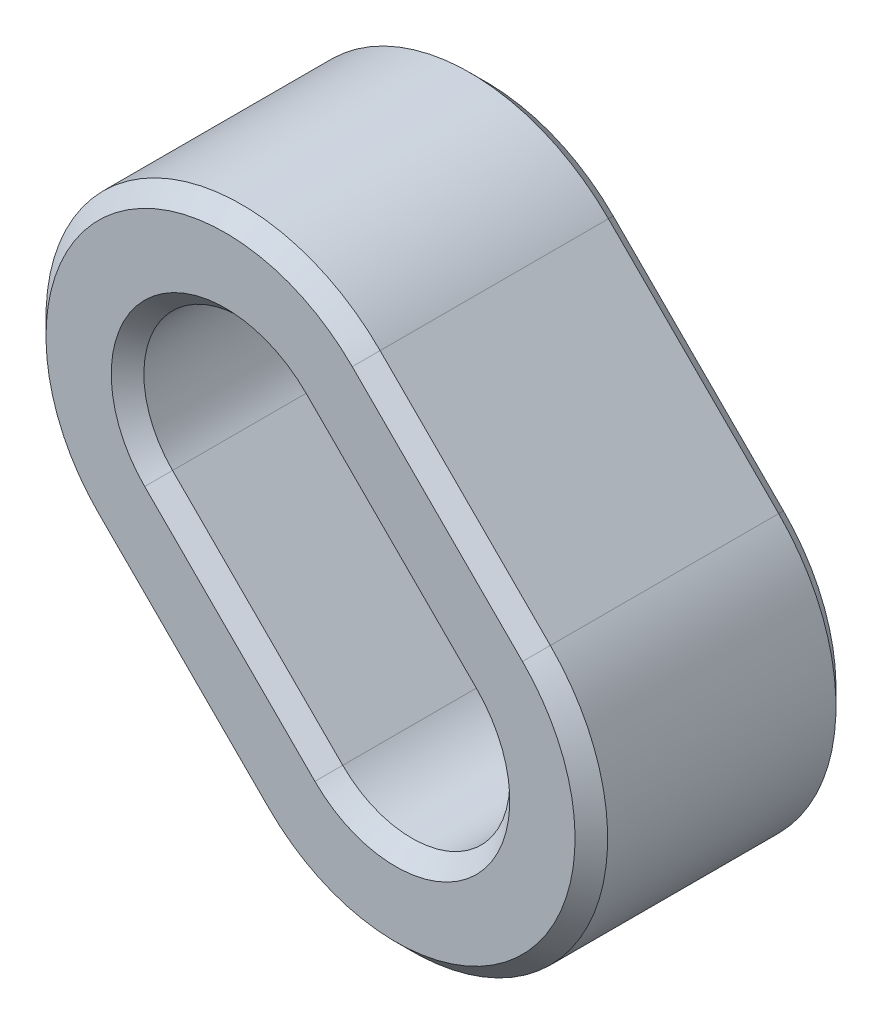
ISO-10303-21;
HEADER;
FILE_DESCRIPTION(('STEP AP214'),'2;1');
FILE_NAME('part.step','',(''),(''),'','','');
FILE_SCHEMA(('AUTOMOTIVE_DESIGN { 1 0 10303 214 1 1 1 1 }'));
ENDSEC;
DATA;
#1=APPLICATION_CONTEXT('core data for automotive mechanical design processes');
#2=APPLICATION_PROTOCOL_DEFINITION('international standard','automotive_design',2000,#1);
#3=PRODUCT_CONTEXT('',#1,'mechanical');
#4=PRODUCT('Part','Part','',(#3));
#5=PRODUCT_RELATED_PRODUCT_CATEGORY('part','',(#4));
#6=PRODUCT_DEFINITION_FORMATION('','',#4);
#7=PRODUCT_DEFINITION_CONTEXT('part definition',#1,'design');
#8=PRODUCT_DEFINITION('design','',#6,#7);
#9=PRODUCT_DEFINITION_SHAPE('','',#8);
#10=(LENGTH_UNIT() NAMED_UNIT(*) SI_UNIT(.MILLI.,.METRE.));
#11=(NAMED_UNIT(*) PLANE_ANGLE_UNIT() SI_UNIT($,.RADIAN.));
#12=(NAMED_UNIT(*) SI_UNIT($,.STERADIAN.) SOLID_ANGLE_UNIT());
#13=UNCERTAINTY_MEASURE_WITH_UNIT(LENGTH_MEASURE(1.E-05),#10,'distance_accuracy_value','');
#14=(GEOMETRIC_REPRESENTATION_CONTEXT(3) GLOBAL_UNCERTAINTY_ASSIGNED_CONTEXT((#13)) GLOBAL_UNIT_ASSIGNED_CONTEXT((#10,
#11,#12)) REPRESENTATION_CONTEXT('',''));
#15=CARTESIAN_POINT('',(0.,0.,0.));
#16=DIRECTION('',(0.,0.,1.));
#17=DIRECTION('',(1.,0.,0.));
#18=AXIS2_PLACEMENT_3D('',#15,#16,#17);
#19=CARTESIAN_POINT('',(74.1428766787926,121.8,8.));
#20=DIRECTION('',(0.,0.,1.));
#21=DIRECTION('',(1.,0.,0.));
#22=AXIS2_PLACEMENT_3D('',#19,#20,#21);
#23=PLANE('',#22);
#24=DIRECTION('',(0.707106781186548,-0.707106781186547,0.));
#25=VECTOR('',#24,1.);
#26=CARTESIAN_POINT('',(76.6177504129455,124.274873734153,8.));
#27=LINE('',#26,#25);
#28=CARTESIAN_POINT('',(76.6177504129455,124.274873734153,8.));
#29=VERTEX_POINT('',#28);
#30=CARTESIAN_POINT('',(81.8361984581022,119.056425688996,8.));
#31=VERTEX_POINT('',#30);
#32=EDGE_CURVE('E54',#29,#31,#27,.T.);
#33=ORIENTED_EDGE('',*,*,#32,.T.);
#34=CARTESIAN_POINT('',(79.3613247239493,116.581551954843,8.));
#35=DIRECTION('',(0.,0.,1.));
#36=DIRECTION('',(1.,0.,0.));
#37=AXIS2_PLACEMENT_3D('',#34,#35,#36);
#38=CIRCLE('',#37,3.50000000000001);
#39=CARTESIAN_POINT('',(76.8864509897964,114.10667822069,8.));
#40=VERTEX_POINT('',#39);
#41=EDGE_CURVE('E13',#31,#40,#38,.F.);
#42=ORIENTED_EDGE('',*,*,#41,.T.);
#43=DIRECTION('',(-0.707106781186547,0.707106781186549,0.));
#44=VECTOR('',#43,1.);
#45=CARTESIAN_POINT('',(71.6680029446397,119.325126265847,8.));
#46=LINE('',#45,#44);
#47=CARTESIAN_POINT('',(71.6680029446397,119.325126265847,8.));
#48=VERTEX_POINT('',#47);
#49=EDGE_CURVE('E241',#40,#48,#46,.T.);
#50=ORIENTED_EDGE('',*,*,#49,.T.);
#51=CARTESIAN_POINT('',(74.1428766787926,121.8,8.));
#52=DIRECTION('',(0.,0.,1.));
#53=DIRECTION('',(1.,0.,0.));
#54=AXIS2_PLACEMENT_3D('',#51,#52,#53);
#55=CIRCLE('',#54,3.5);
#56=EDGE_CURVE('E65',#48,#29,#55,.F.);
#57=ORIENTED_EDGE('',*,*,#56,.T.);
#58=EDGE_LOOP('',(#33,#42,#50,#57));
#59=FACE_BOUND('',#58,.T.);
#60=CARTESIAN_POINT('',(79.3613247239493,116.581551954843,8.));
#61=DIRECTION('',(0.,0.,1.));
#62=DIRECTION('',(1.,0.,0.));
#63=AXIS2_PLACEMENT_3D('',#60,#61,#62);
#64=CIRCLE('',#63,5.50000000000004);
#65=CARTESIAN_POINT('',(75.4722374274233,112.692464658317,8.));
#66=VERTEX_POINT('',#65);
#67=CARTESIAN_POINT('',(83.2504120204754,120.470639251369,8.));
#68=VERTEX_POINT('',#67);
#69=EDGE_CURVE('E236',#66,#68,#64,.T.);
#70=ORIENTED_EDGE('',*,*,#69,.T.);
#71=DIRECTION('',(-0.707106781186548,0.707106781186547,0.));
#72=VECTOR('',#71,1.);
#73=CARTESIAN_POINT('',(78.0319639753186,125.689087296526,8.));
#74=LINE('',#73,#72);
#75=CARTESIAN_POINT('',(78.0319639753186,125.689087296526,8.));
#76=VERTEX_POINT('',#75);
#77=EDGE_CURVE('E238',#68,#76,#74,.T.);
#78=ORIENTED_EDGE('',*,*,#77,.T.);
#79=CARTESIAN_POINT('',(74.1428766787926,121.8,8.));
#80=DIRECTION('',(0.,0.,1.));
#81=DIRECTION('',(1.,0.,0.));
#82=AXIS2_PLACEMENT_3D('',#79,#80,#81);
#83=CIRCLE('',#82,5.50000000000003);
#84=CARTESIAN_POINT('',(70.2537893822666,117.910912703474,8.));
#85=VERTEX_POINT('',#84);
#86=EDGE_CURVE('E232',#76,#85,#83,.T.);
#87=ORIENTED_EDGE('',*,*,#86,.T.);
#88=DIRECTION('',(0.707106781186549,-0.707106781186547,0.));
#89=VECTOR('',#88,1.);
#90=CARTESIAN_POINT('',(75.4722374274233,112.692464658317,8.));
#91=LINE('',#90,#89);
#92=EDGE_CURVE('E234',#85,#66,#91,.T.);
#93=ORIENTED_EDGE('',*,*,#92,.T.);
#94=EDGE_LOOP('',(#70,#78,#87,#93));
#95=FACE_BOUND('',#94,.T.);
#96=ADVANCED_FACE('F45',(#59,#95),#23,.T.);
#97=CARTESIAN_POINT('',(74.1428766787926,121.8,0.));
#98=DIRECTION('',(0.,0.,1.));
#99=DIRECTION('',(1.,0.,0.));
#100=AXIS2_PLACEMENT_3D('',#97,#98,#99);
#101=PLANE('',#100);
#102=CARTESIAN_POINT('',(79.3613247239493,116.581551954843,0.));
#103=DIRECTION('',(0.,0.,1.));
#104=DIRECTION('',(1.,0.,0.));
#105=AXIS2_PLACEMENT_3D('',#102,#103,#104);
#106=CIRCLE('',#105,3.50000000000001);
#107=CARTESIAN_POINT('',(76.8864509897964,114.10667822069,0.));
#108=VERTEX_POINT('',#107);
#109=CARTESIAN_POINT('',(81.8361984581022,119.056425688996,0.));
#110=VERTEX_POINT('',#109);
#111=EDGE_CURVE('E193',#108,#110,#106,.T.);
#112=ORIENTED_EDGE('',*,*,#111,.T.);
#113=DIRECTION('',(-0.707106781186548,0.707106781186547,0.));
#114=VECTOR('',#113,1.);
#115=CARTESIAN_POINT('',(76.6177504129455,124.274873734153,0.));
#116=LINE('',#115,#114);
#117=CARTESIAN_POINT('',(76.6177504129455,124.274873734153,0.));
#118=VERTEX_POINT('',#117);
#119=EDGE_CURVE('E195',#110,#118,#116,.T.);
#120=ORIENTED_EDGE('',*,*,#119,.T.);
#121=CARTESIAN_POINT('',(74.1428766787926,121.8,0.));
#122=DIRECTION('',(0.,0.,1.));
#123=DIRECTION('',(1.,0.,0.));
#124=AXIS2_PLACEMENT_3D('',#121,#122,#123);
#125=CIRCLE('',#124,3.50000000000001);
#126=CARTESIAN_POINT('',(71.6680029446397,119.325126265847,0.));
#127=VERTEX_POINT('',#126);
#128=EDGE_CURVE('E185',#118,#127,#125,.T.);
#129=ORIENTED_EDGE('',*,*,#128,.T.);
#130=DIRECTION('',(0.707106781186547,-0.707106781186549,0.));
#131=VECTOR('',#130,1.);
#132=CARTESIAN_POINT('',(76.8864509897964,114.10667822069,0.));
#133=LINE('',#132,#131);
#134=EDGE_CURVE('E187',#127,#108,#133,.T.);
#135=ORIENTED_EDGE('',*,*,#134,.T.);
#136=EDGE_LOOP('',(#112,#120,#129,#135));
#137=FACE_BOUND('',#136,.T.);
#138=CARTESIAN_POINT('',(79.3613247239493,116.581551954843,0.));
#139=DIRECTION('',(0.,0.,1.));
#140=DIRECTION('',(1.,0.,0.));
#141=AXIS2_PLACEMENT_3D('',#138,#139,#140);
#142=CIRCLE('',#141,5.5);
#143=CARTESIAN_POINT('',(83.2504120204753,120.470639251369,0.));
#144=VERTEX_POINT('',#143);
#145=CARTESIAN_POINT('',(75.4722374274233,112.692464658317,0.));
#146=VERTEX_POINT('',#145);
#147=EDGE_CURVE('E184',#144,#146,#142,.F.);
#148=ORIENTED_EDGE('',*,*,#147,.T.);
#149=DIRECTION('',(-0.707106781186549,0.707106781186547,0.));
#150=VECTOR('',#149,1.);
#151=CARTESIAN_POINT('',(70.2537893822666,117.910912703474,0.));
#152=LINE('',#151,#150);
#153=CARTESIAN_POINT('',(70.2537893822666,117.910912703474,0.));
#154=VERTEX_POINT('',#153);
#155=EDGE_CURVE('E163',#146,#154,#152,.T.);
#156=ORIENTED_EDGE('',*,*,#155,.T.);
#157=CARTESIAN_POINT('',(74.1428766787926,121.8,0.));
#158=DIRECTION('',(0.,0.,1.));
#159=DIRECTION('',(1.,0.,0.));
#160=AXIS2_PLACEMENT_3D('',#157,#158,#159);
#161=CIRCLE('',#160,5.5);
#162=CARTESIAN_POINT('',(78.0319639753186,125.689087296526,0.));
#163=VERTEX_POINT('',#162);
#164=EDGE_CURVE('E173',#154,#163,#161,.F.);
#165=ORIENTED_EDGE('',*,*,#164,.T.);
#166=DIRECTION('',(0.707106781186548,-0.707106781186547,0.));
#167=VECTOR('',#166,1.);
#168=CARTESIAN_POINT('',(78.0319639753186,125.689087296526,0.));
#169=LINE('',#168,#167);
#170=EDGE_CURVE('E179',#163,#144,#169,.T.);
#171=ORIENTED_EDGE('',*,*,#170,.T.);
#172=EDGE_LOOP('',(#148,#156,#165,#171));
#173=FACE_BOUND('',#172,.T.);
#174=ADVANCED_FACE('F182',(#137,#173),#101,.F.);
#175=CARTESIAN_POINT('',(74.1428766787926,121.8,8.));
#176=DIRECTION('',(0.,0.,-1.));
#177=DIRECTION('',(-1.,0.,0.));
#178=AXIS2_PLACEMENT_3D('',#175,#176,#177);
#179=CYLINDRICAL_SURFACE('',#178,6.00000000000001);
#180=DIRECTION('',(0.,0.,-1.));
#181=VECTOR('',#180,1.);
#182=CARTESIAN_POINT('',(78.3855173659119,126.042640687119,8.));
#183=LINE('',#182,#181);
#184=CARTESIAN_POINT('',(78.3855173659119,126.042640687119,7.50000000000002));
#185=VERTEX_POINT('',#184);
#186=CARTESIAN_POINT('',(78.3855173659119,126.042640687119,0.50000000000001));
#187=VERTEX_POINT('',#186);
#188=EDGE_CURVE('E316',#185,#187,#183,.T.);
#189=ORIENTED_EDGE('',*,*,#188,.T.);
#190=CARTESIAN_POINT('',(74.1428766787926,121.8,0.50000000000001));
#191=DIRECTION('',(0.,0.,1.));
#192=DIRECTION('',(1.,0.,0.));
#193=AXIS2_PLACEMENT_3D('',#190,#191,#192);
#194=CIRCLE('',#193,6.00000000000001);
#195=CARTESIAN_POINT('',(69.9002359916733,117.557359312881,0.50000000000001));
#196=VERTEX_POINT('',#195);
#197=EDGE_CURVE('E230',#187,#196,#194,.T.);
#198=ORIENTED_EDGE('',*,*,#197,.T.);
#199=DIRECTION('',(0.,0.,-1.));
#200=VECTOR('',#199,1.);
#201=CARTESIAN_POINT('',(69.9002359916733,117.557359312881,8.));
#202=LINE('',#201,#200);
#203=CARTESIAN_POINT('',(69.9002359916733,117.557359312881,7.50000000000002));
#204=VERTEX_POINT('',#203);
#205=EDGE_CURVE('E180',#204,#196,#202,.T.);
#206=ORIENTED_EDGE('',*,*,#205,.F.);
#207=CARTESIAN_POINT('',(74.1428766787926,121.8,7.50000000000002));
#208=DIRECTION('',(0.,0.,1.));
#209=DIRECTION('',(1.,0.,0.));
#210=AXIS2_PLACEMENT_3D('',#207,#208,#209);
#211=CIRCLE('',#210,6.00000000000001);
#212=EDGE_CURVE('E228',#204,#185,#211,.F.);
#213=ORIENTED_EDGE('',*,*,#212,.T.);
#214=EDGE_LOOP('',(#189,#198,#206,#213));
#215=FACE_BOUND('',#214,.T.);
#216=ADVANCED_FACE('F298',(#215),#179,.T.);
#217=CARTESIAN_POINT('',(69.9002359916733,117.557359312881,8.));
#218=DIRECTION('',(0.707106781186547,0.707106781186549,0.));
#219=DIRECTION('',(-0.707106781186549,0.707106781186547,0.));
#220=AXIS2_PLACEMENT_3D('',#217,#218,#219);
#221=PLANE('',#220);
#222=ORIENTED_EDGE('',*,*,#205,.T.);
#223=DIRECTION('',(0.707106781186549,-0.707106781186547,0.));
#224=VECTOR('',#223,1.);
#225=CARTESIAN_POINT('',(69.9002359916733,117.557359312881,0.500000000000009));
#226=LINE('',#225,#224);
#227=CARTESIAN_POINT('',(75.11868403683,112.338911267724,0.50000000000001));
#228=VERTEX_POINT('',#227);
#229=EDGE_CURVE('E166',#196,#228,#226,.T.);
#230=ORIENTED_EDGE('',*,*,#229,.T.);
#231=DIRECTION('',(0.,0.,-1.));
#232=VECTOR('',#231,1.);
#233=CARTESIAN_POINT('',(75.11868403683,112.338911267724,8.));
#234=LINE('',#233,#232);
#235=CARTESIAN_POINT('',(75.11868403683,112.338911267724,7.50000000000002));
#236=VERTEX_POINT('',#235);
#237=EDGE_CURVE('E295',#236,#228,#234,.T.);
#238=ORIENTED_EDGE('',*,*,#237,.F.);
#239=DIRECTION('',(-0.707106781186549,0.707106781186547,0.));
#240=VECTOR('',#239,1.);
#241=CARTESIAN_POINT('',(69.9002359916733,117.557359312881,7.50000000000002));
#242=LINE('',#241,#240);
#243=EDGE_CURVE('E216',#236,#204,#242,.T.);
#244=ORIENTED_EDGE('',*,*,#243,.T.);
#245=EDGE_LOOP('',(#222,#230,#238,#244));
#246=FACE_BOUND('',#245,.T.);
#247=ADVANCED_FACE('F293',(#246),#221,.F.);
#248=CARTESIAN_POINT('',(79.3613247239493,116.581551954843,8.));
#249=DIRECTION('',(0.,0.,-1.));
#250=DIRECTION('',(-1.,0.,0.));
#251=AXIS2_PLACEMENT_3D('',#248,#249,#250);
#252=CYLINDRICAL_SURFACE('',#251,6.00000000000001);
#253=ORIENTED_EDGE('',*,*,#237,.T.);
#254=CARTESIAN_POINT('',(79.3613247239493,116.581551954843,0.50000000000001));
#255=DIRECTION('',(0.,0.,1.));
#256=DIRECTION('',(1.,0.,0.));
#257=AXIS2_PLACEMENT_3D('',#254,#255,#256);
#258=CIRCLE('',#257,6.00000000000001);
#259=CARTESIAN_POINT('',(83.6039654110686,120.824192641963,0.50000000000001));
#260=VERTEX_POINT('',#259);
#261=EDGE_CURVE('E221',#228,#260,#258,.T.);
#262=ORIENTED_EDGE('',*,*,#261,.T.);
#263=DIRECTION('',(0.,0.,-1.));
#264=VECTOR('',#263,1.);
#265=CARTESIAN_POINT('',(83.6039654110686,120.824192641963,8.));
#266=LINE('',#265,#264);
#267=CARTESIAN_POINT('',(83.6039654110686,120.824192641963,7.50000000000002));
#268=VERTEX_POINT('',#267);
#269=EDGE_CURVE('E301',#268,#260,#266,.T.);
#270=ORIENTED_EDGE('',*,*,#269,.F.);
#271=CARTESIAN_POINT('',(79.3613247239493,116.581551954843,7.50000000000002));
#272=DIRECTION('',(0.,0.,1.));
#273=DIRECTION('',(1.,0.,0.));
#274=AXIS2_PLACEMENT_3D('',#271,#272,#273);
#275=CIRCLE('',#274,6.00000000000001);
#276=EDGE_CURVE('E219',#268,#236,#275,.F.);
#277=ORIENTED_EDGE('',*,*,#276,.T.);
#278=EDGE_LOOP('',(#253,#262,#270,#277));
#279=FACE_BOUND('',#278,.T.);
#280=ADVANCED_FACE('F314',(#279),#252,.T.);
#281=CARTESIAN_POINT('',(78.3855173659119,126.042640687119,8.));
#282=DIRECTION('',(-0.707106781186547,-0.707106781186548,0.));
#283=DIRECTION('',(0.707106781186548,-0.707106781186547,0.));
#284=AXIS2_PLACEMENT_3D('',#281,#282,#283);
#285=PLANE('',#284);
#286=ORIENTED_EDGE('',*,*,#269,.T.);
#287=DIRECTION('',(-0.707106781186548,0.707106781186547,0.));
#288=VECTOR('',#287,1.);
#289=CARTESIAN_POINT('',(78.3855173659119,126.042640687119,0.50000000000001));
#290=LINE('',#289,#288);
#291=EDGE_CURVE('E226',#260,#187,#290,.T.);
#292=ORIENTED_EDGE('',*,*,#291,.T.);
#293=ORIENTED_EDGE('',*,*,#188,.F.);
#294=DIRECTION('',(0.707106781186548,-0.707106781186547,0.));
#295=VECTOR('',#294,1.);
#296=CARTESIAN_POINT('',(83.6039654110686,120.824192641963,7.50000000000002));
#297=LINE('',#296,#295);
#298=EDGE_CURVE('E223',#185,#268,#297,.T.);
#299=ORIENTED_EDGE('',*,*,#298,.T.);
#300=EDGE_LOOP('',(#286,#292,#293,#299));
#301=FACE_BOUND('',#300,.T.);
#302=ADVANCED_FACE('F385',(#301),#285,.F.);
#303=CARTESIAN_POINT('',(74.1428766787926,121.8,8.));
#304=DIRECTION('',(0.,0.,-1.));
#305=DIRECTION('',(-1.,0.,0.));
#306=AXIS2_PLACEMENT_3D('',#303,#304,#305);
#307=CYLINDRICAL_SURFACE('',#306,3.);
#308=DIRECTION('',(0.,0.,-1.));
#309=VECTOR('',#308,1.);
#310=CARTESIAN_POINT('',(72.021556335233,119.67867965644,8.));
#311=LINE('',#310,#309);
#312=CARTESIAN_POINT('',(72.021556335233,119.67867965644,7.5));
#313=VERTEX_POINT('',#312);
#314=CARTESIAN_POINT('',(72.021556335233,119.67867965644,0.500000000000001));
#315=VERTEX_POINT('',#314);
#316=EDGE_CURVE('E317',#313,#315,#311,.T.);
#317=ORIENTED_EDGE('',*,*,#316,.T.);
#318=CARTESIAN_POINT('',(74.1428766787926,121.8,0.500000000000001));
#319=DIRECTION('',(0.,0.,1.));
#320=DIRECTION('',(1.,0.,0.));
#321=AXIS2_PLACEMENT_3D('',#318,#319,#320);
#322=CIRCLE('',#321,3.);
#323=CARTESIAN_POINT('',(76.2641970223522,123.92132034356,0.500000000000001));
#324=VERTEX_POINT('',#323);
#325=EDGE_CURVE('E214',#315,#324,#322,.F.);
#326=ORIENTED_EDGE('',*,*,#325,.T.);
#327=DIRECTION('',(0.,0.,-1.));
#328=VECTOR('',#327,1.);
#329=CARTESIAN_POINT('',(76.2641970223522,123.92132034356,8.));
#330=LINE('',#329,#328);
#331=CARTESIAN_POINT('',(76.2641970223522,123.92132034356,7.5));
#332=VERTEX_POINT('',#331);
#333=EDGE_CURVE('E255',#332,#324,#330,.T.);
#334=ORIENTED_EDGE('',*,*,#333,.F.);
#335=CARTESIAN_POINT('',(74.1428766787926,121.8,7.5));
#336=DIRECTION('',(0.,0.,1.));
#337=DIRECTION('',(1.,0.,0.));
#338=AXIS2_PLACEMENT_3D('',#335,#336,#337);
#339=CIRCLE('',#338,3.);
#340=EDGE_CURVE('E212',#332,#313,#339,.T.);
#341=ORIENTED_EDGE('',*,*,#340,.T.);
#342=EDGE_LOOP('',(#317,#326,#334,#341));
#343=FACE_BOUND('',#342,.T.);
#344=ADVANCED_FACE('F382',(#343),#307,.F.);
#345=CARTESIAN_POINT('',(72.021556335233,119.67867965644,8.));
#346=DIRECTION('',(0.707106781186549,0.707106781186547,0.));
#347=DIRECTION('',(-0.707106781186547,0.707106781186549,0.));
#348=AXIS2_PLACEMENT_3D('',#345,#346,#347);
#349=PLANE('',#348);
#350=DIRECTION('',(0.,0.,-1.));
#351=VECTOR('',#350,1.);
#352=CARTESIAN_POINT('',(77.2400043803897,114.460231611284,8.));
#353=LINE('',#352,#351);
#354=CARTESIAN_POINT('',(77.2400043803897,114.460231611284,7.5));
#355=VERTEX_POINT('',#354);
#356=CARTESIAN_POINT('',(77.2400043803897,114.460231611284,0.500000000000001));
#357=VERTEX_POINT('',#356);
#358=EDGE_CURVE('E322',#355,#357,#353,.T.);
#359=ORIENTED_EDGE('',*,*,#358,.T.);
#360=DIRECTION('',(-0.707106781186547,0.707106781186549,0.));
#361=VECTOR('',#360,1.);
#362=CARTESIAN_POINT('',(72.021556335233,119.67867965644,0.500000000000001));
#363=LINE('',#362,#361);
#364=EDGE_CURVE('E210',#357,#315,#363,.T.);
#365=ORIENTED_EDGE('',*,*,#364,.T.);
#366=ORIENTED_EDGE('',*,*,#316,.F.);
#367=DIRECTION('',(0.707106781186547,-0.707106781186549,0.));
#368=VECTOR('',#367,1.);
#369=CARTESIAN_POINT('',(72.021556335233,119.67867965644,7.5));
#370=LINE('',#369,#368);
#371=EDGE_CURVE('E208',#313,#355,#370,.T.);
#372=ORIENTED_EDGE('',*,*,#371,.T.);
#373=EDGE_LOOP('',(#359,#365,#366,#372));
#374=FACE_BOUND('',#373,.T.);
#375=ADVANCED_FACE('F360',(#374),#349,.T.);
#376=CARTESIAN_POINT('',(79.3613247239493,116.581551954843,8.));
#377=DIRECTION('',(0.,0.,-1.));
#378=DIRECTION('',(-1.,0.,0.));
#379=AXIS2_PLACEMENT_3D('',#376,#377,#378);
#380=CYLINDRICAL_SURFACE('',#379,3.00000000000001);
#381=DIRECTION('',(0.,0.,-1.));
#382=VECTOR('',#381,1.);
#383=CARTESIAN_POINT('',(81.482645067509,118.702872298403,8.));
#384=LINE('',#383,#382);
#385=CARTESIAN_POINT('',(81.482645067509,118.702872298403,7.5));
#386=VERTEX_POINT('',#385);
#387=CARTESIAN_POINT('',(81.482645067509,118.702872298403,0.500000000000001));
#388=VERTEX_POINT('',#387);
#389=EDGE_CURVE('E325',#386,#388,#384,.T.);
#390=ORIENTED_EDGE('',*,*,#389,.T.);
#391=CARTESIAN_POINT('',(79.3613247239493,116.581551954843,0.500000000000001));
#392=DIRECTION('',(0.,0.,1.));
#393=DIRECTION('',(1.,0.,0.));
#394=AXIS2_PLACEMENT_3D('',#391,#392,#393);
#395=CIRCLE('',#394,3.00000000000001);
#396=EDGE_CURVE('E206',#388,#357,#395,.F.);
#397=ORIENTED_EDGE('',*,*,#396,.T.);
#398=ORIENTED_EDGE('',*,*,#358,.F.);
#399=CARTESIAN_POINT('',(79.3613247239493,116.581551954843,7.5));
#400=DIRECTION('',(0.,0.,1.));
#401=DIRECTION('',(1.,0.,0.));
#402=AXIS2_PLACEMENT_3D('',#399,#400,#401);
#403=CIRCLE('',#402,3.00000000000001);
#404=EDGE_CURVE('E203',#355,#386,#403,.T.);
#405=ORIENTED_EDGE('',*,*,#404,.T.);
#406=EDGE_LOOP('',(#390,#397,#398,#405));
#407=FACE_BOUND('',#406,.T.);
#408=ADVANCED_FACE('F356',(#407),#380,.F.);
#409=CARTESIAN_POINT('',(76.2641970223522,123.92132034356,8.));
#410=DIRECTION('',(-0.707106781186547,-0.707106781186548,0.));
#411=DIRECTION('',(0.707106781186548,-0.707106781186547,0.));
#412=AXIS2_PLACEMENT_3D('',#409,#410,#411);
#413=PLANE('',#412);
#414=ORIENTED_EDGE('',*,*,#333,.T.);
#415=DIRECTION('',(0.707106781186548,-0.707106781186547,0.));
#416=VECTOR('',#415,1.);
#417=CARTESIAN_POINT('',(81.482645067509,118.702872298403,0.500000000000002));
#418=LINE('',#417,#416);
#419=EDGE_CURVE('E200',#324,#388,#418,.T.);
#420=ORIENTED_EDGE('',*,*,#419,.T.);
#421=ORIENTED_EDGE('',*,*,#389,.F.);
#422=DIRECTION('',(-0.707106781186548,0.707106781186547,0.));
#423=VECTOR('',#422,1.);
#424=CARTESIAN_POINT('',(76.2641970223522,123.92132034356,7.5));
#425=LINE('',#424,#423);
#426=EDGE_CURVE('E198',#386,#332,#425,.T.);
#427=ORIENTED_EDGE('',*,*,#426,.T.);
#428=EDGE_LOOP('',(#414,#420,#421,#427));
#429=FACE_BOUND('',#428,.T.);
#430=ADVANCED_FACE('F332',(#429),#413,.T.);
#431=CARTESIAN_POINT('',(71.6680029446397,119.325126265847,0.));
#432=DIRECTION('',(0.500000000000002,0.500000000000001,-0.707106781186545));
#433=DIRECTION('',(-0.707106781186547,0.707106781186549,0.));
#434=AXIS2_PLACEMENT_3D('',#431,#432,#433);
#435=PLANE('',#434);
#436=DIRECTION('',(-0.500000000000013,-0.499999999999994,-0.707106781186543));
#437=VECTOR('',#436,1.);
#438=CARTESIAN_POINT('',(72.021556335233,119.67867965644,0.500000000000001));
#439=LINE('',#438,#437);
#440=EDGE_CURVE('E249',#315,#127,#439,.T.);
#441=ORIENTED_EDGE('',*,*,#440,.F.);
#442=ORIENTED_EDGE('',*,*,#364,.F.);
#443=DIRECTION('',(0.500000000000008,0.500000000000008,0.707106781186536));
#444=VECTOR('',#443,1.);
#445=CARTESIAN_POINT('',(76.8864509897964,114.10667822069,0.));
#446=LINE('',#445,#444);
#447=EDGE_CURVE('E252',#108,#357,#446,.T.);
#448=ORIENTED_EDGE('',*,*,#447,.F.);
#449=ORIENTED_EDGE('',*,*,#134,.F.);
#450=EDGE_LOOP('',(#441,#442,#448,#449));
#451=FACE_BOUND('',#450,.T.);
#452=ADVANCED_FACE('F364',(#451),#435,.T.);
#453=CARTESIAN_POINT('',(79.3613247239493,116.581551954843,0.));
#454=DIRECTION('',(0.,0.,-1.));
#455=DIRECTION('',(-1.,0.,0.));
#456=AXIS2_PLACEMENT_3D('',#453,#454,#455);
#457=CONICAL_SURFACE('',#456,3.50000000000001,0.785398163397445);
#458=ORIENTED_EDGE('',*,*,#447,.T.);
#459=ORIENTED_EDGE('',*,*,#396,.F.);
#460=DIRECTION('',(-0.499999999999984,-0.500000000000003,0.707106781186557));
#461=VECTOR('',#460,1.);
#462=CARTESIAN_POINT('',(81.8361984581022,119.056425688996,0.));
#463=LINE('',#462,#461);
#464=EDGE_CURVE('E247',#110,#388,#463,.T.);
#465=ORIENTED_EDGE('',*,*,#464,.F.);
#466=ORIENTED_EDGE('',*,*,#111,.F.);
#467=EDGE_LOOP('',(#458,#459,#465,#466));
#468=FACE_BOUND('',#467,.T.);
#469=ADVANCED_FACE('F353',(#468),#457,.F.);
#470=CARTESIAN_POINT('',(74.1428766787926,121.8,0.));
#471=DIRECTION('',(0.,0.,-1.));
#472=DIRECTION('',(-1.,0.,0.));
#473=AXIS2_PLACEMENT_3D('',#470,#471,#472);
#474=CONICAL_SURFACE('',#473,3.50000000000001,0.785398163397455);
#475=ORIENTED_EDGE('',*,*,#440,.T.);
#476=ORIENTED_EDGE('',*,*,#128,.F.);
#477=DIRECTION('',(0.499999999999994,0.500000000000013,-0.707106781186543));
#478=VECTOR('',#477,1.);
#479=CARTESIAN_POINT('',(76.2641970223522,123.92132034356,0.500000000000001));
#480=LINE('',#479,#478);
#481=EDGE_CURVE('E245',#324,#118,#480,.T.);
#482=ORIENTED_EDGE('',*,*,#481,.F.);
#483=ORIENTED_EDGE('',*,*,#325,.F.);
#484=EDGE_LOOP('',(#475,#476,#482,#483));
#485=FACE_BOUND('',#484,.T.);
#486=ADVANCED_FACE('F346',(#485),#474,.F.);
#487=CARTESIAN_POINT('',(76.6177504129455,124.274873734153,0.));
#488=DIRECTION('',(-0.499999999999996,-0.499999999999997,-0.707106781186552));
#489=DIRECTION('',(0.707106781186548,-0.707106781186547,0.));
#490=AXIS2_PLACEMENT_3D('',#487,#488,#489);
#491=PLANE('',#490);
#492=ORIENTED_EDGE('',*,*,#464,.T.);
#493=ORIENTED_EDGE('',*,*,#419,.F.);
#494=ORIENTED_EDGE('',*,*,#481,.T.);
#495=ORIENTED_EDGE('',*,*,#119,.F.);
#496=EDGE_LOOP('',(#492,#493,#494,#495));
#497=FACE_BOUND('',#496,.T.);
#498=ADVANCED_FACE('F339',(#497),#491,.T.);
#499=CARTESIAN_POINT('',(78.3855173659119,126.042640687119,0.50000000000001));
#500=DIRECTION('',(-0.5,-0.500000000000002,0.707106781186546));
#501=DIRECTION('',(-0.707106781186548,0.707106781186547,0.));
#502=AXIS2_PLACEMENT_3D('',#499,#500,#501);
#503=PLANE('',#502);
#504=DIRECTION('',(0.500000000000004,0.500000000000004,0.707106781186542));
#505=VECTOR('',#504,1.);
#506=CARTESIAN_POINT('',(83.2504120204753,120.470639251369,0.));
#507=LINE('',#506,#505);
#508=EDGE_CURVE('E169',#144,#260,#507,.T.);
#509=ORIENTED_EDGE('',*,*,#508,.F.);
#510=ORIENTED_EDGE('',*,*,#170,.F.);
#511=DIRECTION('',(-0.499999999999989,-0.500000000000009,-0.707106781186549));
#512=VECTOR('',#511,1.);
#513=CARTESIAN_POINT('',(78.3855173659119,126.042640687119,0.50000000000001));
#514=LINE('',#513,#512);
#515=EDGE_CURVE('E176',#187,#163,#514,.T.);
#516=ORIENTED_EDGE('',*,*,#515,.F.);
#517=ORIENTED_EDGE('',*,*,#291,.F.);
#518=EDGE_LOOP('',(#509,#510,#516,#517));
#519=FACE_BOUND('',#518,.T.);
#520=ADVANCED_FACE('F307',(#519),#503,.F.);
#521=CARTESIAN_POINT('',(74.1428766787926,121.8,0.50000000000001));
#522=DIRECTION('',(0.,0.,1.));
#523=DIRECTION('',(1.,0.,0.));
#524=AXIS2_PLACEMENT_3D('',#521,#522,#523);
#525=CONICAL_SURFACE('',#524,6.00000000000001,0.785398163397447);
#526=ORIENTED_EDGE('',*,*,#515,.T.);
#527=ORIENTED_EDGE('',*,*,#164,.F.);
#528=DIRECTION('',(0.499999999999989,0.500000000000009,-0.707106781186549));
#529=VECTOR('',#528,1.);
#530=CARTESIAN_POINT('',(69.9002359916733,117.557359312881,0.50000000000001));
#531=LINE('',#530,#529);
#532=EDGE_CURVE('E159',#196,#154,#531,.T.);
#533=ORIENTED_EDGE('',*,*,#532,.F.);
#534=ORIENTED_EDGE('',*,*,#197,.F.);
#535=EDGE_LOOP('',(#526,#527,#533,#534));
#536=FACE_BOUND('',#535,.T.);
#537=ADVANCED_FACE('F174',(#536),#525,.T.);
#538=CARTESIAN_POINT('',(79.3613247239493,116.581551954843,0.50000000000001));
#539=DIRECTION('',(0.,0.,1.));
#540=DIRECTION('',(1.,0.,0.));
#541=AXIS2_PLACEMENT_3D('',#538,#539,#540);
#542=CONICAL_SURFACE('',#541,6.00000000000001,0.785398163397447);
#543=ORIENTED_EDGE('',*,*,#508,.T.);
#544=ORIENTED_EDGE('',*,*,#261,.F.);
#545=DIRECTION('',(-0.499999999999999,-0.500000000000019,0.707106781186535));
#546=VECTOR('',#545,1.);
#547=CARTESIAN_POINT('',(75.4722374274233,112.692464658317,0.));
#548=LINE('',#547,#546);
#549=EDGE_CURVE('E170',#146,#228,#548,.T.);
#550=ORIENTED_EDGE('',*,*,#549,.F.);
#551=ORIENTED_EDGE('',*,*,#147,.F.);
#552=EDGE_LOOP('',(#543,#544,#550,#551));
#553=FACE_BOUND('',#552,.T.);
#554=ADVANCED_FACE('F310',(#553),#542,.T.);
#555=CARTESIAN_POINT('',(69.9002359916733,117.557359312881,0.50000000000001));
#556=DIRECTION('',(0.5,0.500000000000002,0.707106781186546));
#557=DIRECTION('',(0.707106781186549,-0.707106781186547,0.));
#558=AXIS2_PLACEMENT_3D('',#555,#556,#557);
#559=PLANE('',#558);
#560=ORIENTED_EDGE('',*,*,#532,.T.);
#561=ORIENTED_EDGE('',*,*,#155,.F.);
#562=ORIENTED_EDGE('',*,*,#549,.T.);
#563=ORIENTED_EDGE('',*,*,#229,.F.);
#564=EDGE_LOOP('',(#560,#561,#562,#563));
#565=FACE_BOUND('',#564,.T.);
#566=ADVANCED_FACE('F161',(#565),#559,.F.);
#567=CARTESIAN_POINT('',(74.1428766787926,121.8,7.5));
#568=DIRECTION('',(0.,0.,1.));
#569=DIRECTION('',(1.,0.,0.));
#570=AXIS2_PLACEMENT_3D('',#567,#568,#569);
#571=CONICAL_SURFACE('',#570,3.,0.785398163397443);
#572=DIRECTION('',(-0.499999999999997,-0.499999999999997,-0.707106781186552));
#573=VECTOR('',#572,1.);
#574=CARTESIAN_POINT('',(76.6177504129455,124.274873734153,8.));
#575=LINE('',#574,#573);
#576=EDGE_CURVE('E265',#29,#332,#575,.T.);
#577=ORIENTED_EDGE('',*,*,#576,.F.);
#578=ORIENTED_EDGE('',*,*,#56,.F.);
#579=DIRECTION('',(-0.499999999999997,-0.499999999999997,0.707106781186552));
#580=VECTOR('',#579,1.);
#581=CARTESIAN_POINT('',(72.021556335233,119.67867965644,7.5));
#582=LINE('',#581,#580);
#583=EDGE_CURVE('E256',#313,#48,#582,.T.);
#584=ORIENTED_EDGE('',*,*,#583,.F.);
#585=ORIENTED_EDGE('',*,*,#340,.F.);
#586=EDGE_LOOP('',(#577,#578,#584,#585));
#587=FACE_BOUND('',#586,.T.);
#588=ADVANCED_FACE('F429',(#587),#571,.F.);
#589=CARTESIAN_POINT('',(72.021556335233,119.67867965644,7.5));
#590=DIRECTION('',(-0.500000000000004,-0.500000000000002,-0.707106781186544));
#591=DIRECTION('',(0.707106781186547,-0.707106781186549,0.));
#592=AXIS2_PLACEMENT_3D('',#589,#590,#591);
#593=PLANE('',#592);
#594=ORIENTED_EDGE('',*,*,#583,.T.);
#595=ORIENTED_EDGE('',*,*,#49,.F.);
#596=DIRECTION('',(-0.499999999999997,-0.499999999999997,0.707106781186552));
#597=VECTOR('',#596,1.);
#598=CARTESIAN_POINT('',(77.2400043803897,114.460231611284,7.5));
#599=LINE('',#598,#597);
#600=EDGE_CURVE('E263',#355,#40,#599,.T.);
#601=ORIENTED_EDGE('',*,*,#600,.F.);
#602=ORIENTED_EDGE('',*,*,#371,.F.);
#603=EDGE_LOOP('',(#594,#595,#601,#602));
#604=FACE_BOUND('',#603,.T.);
#605=ADVANCED_FACE('F435',(#604),#593,.F.);
#606=CARTESIAN_POINT('',(76.2641970223522,123.92132034356,7.5));
#607=DIRECTION('',(0.500000000000002,0.500000000000004,-0.707106781186544));
#608=DIRECTION('',(-0.707106781186548,0.707106781186547,0.));
#609=AXIS2_PLACEMENT_3D('',#606,#607,#608);
#610=PLANE('',#609);
#611=ORIENTED_EDGE('',*,*,#576,.T.);
#612=ORIENTED_EDGE('',*,*,#426,.F.);
#613=DIRECTION('',(-0.499999999999997,-0.499999999999997,-0.707106781186552));
#614=VECTOR('',#613,1.);
#615=CARTESIAN_POINT('',(81.8361984581022,119.056425688996,8.));
#616=LINE('',#615,#614);
#617=EDGE_CURVE('E261',#31,#386,#616,.T.);
#618=ORIENTED_EDGE('',*,*,#617,.F.);
#619=ORIENTED_EDGE('',*,*,#32,.F.);
#620=EDGE_LOOP('',(#611,#612,#618,#619));
#621=FACE_BOUND('',#620,.T.);
#622=ADVANCED_FACE('F443',(#621),#610,.F.);
#623=CARTESIAN_POINT('',(79.3613247239493,116.581551954843,7.5));
#624=DIRECTION('',(0.,0.,1.));
#625=DIRECTION('',(1.,0.,0.));
#626=AXIS2_PLACEMENT_3D('',#623,#624,#625);
#627=CONICAL_SURFACE('',#626,3.00000000000001,0.785398163397442);
#628=ORIENTED_EDGE('',*,*,#600,.T.);
#629=ORIENTED_EDGE('',*,*,#41,.F.);
#630=ORIENTED_EDGE('',*,*,#617,.T.);
#631=ORIENTED_EDGE('',*,*,#404,.F.);
#632=EDGE_LOOP('',(#628,#629,#630,#631));
#633=FACE_BOUND('',#632,.T.);
#634=ADVANCED_FACE('F451',(#633),#627,.F.);
#635=CARTESIAN_POINT('',(70.2537893822666,117.910912703474,8.));
#636=DIRECTION('',(-0.500000000000002,-0.500000000000003,0.707106781186544));
#637=DIRECTION('',(-0.707106781186549,0.707106781186547,0.));
#638=AXIS2_PLACEMENT_3D('',#635,#636,#637);
#639=PLANE('',#638);
#640=DIRECTION('',(0.499999999999997,0.499999999999997,0.707106781186551));
#641=VECTOR('',#640,1.);
#642=CARTESIAN_POINT('',(69.9002359916733,117.557359312881,7.50000000000002));
#643=LINE('',#642,#641);
#644=EDGE_CURVE('E273',#204,#85,#643,.T.);
#645=ORIENTED_EDGE('',*,*,#644,.F.);
#646=ORIENTED_EDGE('',*,*,#243,.F.);
#647=DIRECTION('',(-0.499999999999997,-0.499999999999997,-0.707106781186551));
#648=VECTOR('',#647,1.);
#649=CARTESIAN_POINT('',(75.4722374274233,112.692464658317,8.));
#650=LINE('',#649,#648);
#651=EDGE_CURVE('E49',#66,#236,#650,.T.);
#652=ORIENTED_EDGE('',*,*,#651,.F.);
#653=ORIENTED_EDGE('',*,*,#92,.F.);
#654=EDGE_LOOP('',(#645,#646,#652,#653));
#655=FACE_BOUND('',#654,.T.);
#656=ADVANCED_FACE('F47',(#655),#639,.T.);
#657=CARTESIAN_POINT('',(79.3613247239493,116.581551954843,8.));
#658=DIRECTION('',(0.,0.,-1.));
#659=DIRECTION('',(-1.,0.,0.));
#660=AXIS2_PLACEMENT_3D('',#657,#658,#659);
#661=CONICAL_SURFACE('',#660,5.50000000000004,0.785398163397434);
#662=ORIENTED_EDGE('',*,*,#651,.T.);
#663=ORIENTED_EDGE('',*,*,#276,.F.);
#664=DIRECTION('',(0.499999999999997,0.499999999999997,-0.707106781186551));
#665=VECTOR('',#664,1.);
#666=CARTESIAN_POINT('',(83.2504120204754,120.470639251369,8.));
#667=LINE('',#666,#665);
#668=EDGE_CURVE('E272',#68,#268,#667,.T.);
#669=ORIENTED_EDGE('',*,*,#668,.F.);
#670=ORIENTED_EDGE('',*,*,#69,.F.);
#671=EDGE_LOOP('',(#662,#663,#669,#670));
#672=FACE_BOUND('',#671,.T.);
#673=ADVANCED_FACE('F284',(#672),#661,.T.);
#674=CARTESIAN_POINT('',(74.1428766787926,121.8,8.));
#675=DIRECTION('',(0.,0.,-1.));
#676=DIRECTION('',(-1.,0.,0.));
#677=AXIS2_PLACEMENT_3D('',#674,#675,#676);
#678=CONICAL_SURFACE('',#677,5.50000000000003,0.785398163397444);
#679=ORIENTED_EDGE('',*,*,#644,.T.);
#680=ORIENTED_EDGE('',*,*,#86,.F.);
#681=DIRECTION('',(-0.499999999999997,-0.499999999999997,0.707106781186551));
#682=VECTOR('',#681,1.);
#683=CARTESIAN_POINT('',(78.3855173659119,126.042640687119,7.50000000000002));
#684=LINE('',#683,#682);
#685=EDGE_CURVE('E270',#185,#76,#684,.T.);
#686=ORIENTED_EDGE('',*,*,#685,.F.);
#687=ORIENTED_EDGE('',*,*,#212,.F.);
#688=EDGE_LOOP('',(#679,#680,#686,#687));
#689=FACE_BOUND('',#688,.T.);
#690=ADVANCED_FACE('F471',(#689),#678,.T.);
#691=CARTESIAN_POINT('',(78.0319639753186,125.689087296526,8.));
#692=DIRECTION('',(0.500000000000002,0.500000000000003,0.707106781186544));
#693=DIRECTION('',(0.707106781186548,-0.707106781186547,0.));
#694=AXIS2_PLACEMENT_3D('',#691,#692,#693);
#695=PLANE('',#694);
#696=ORIENTED_EDGE('',*,*,#668,.T.);
#697=ORIENTED_EDGE('',*,*,#298,.F.);
#698=ORIENTED_EDGE('',*,*,#685,.T.);
#699=ORIENTED_EDGE('',*,*,#77,.F.);
#700=EDGE_LOOP('',(#696,#697,#698,#699));
#701=FACE_BOUND('',#700,.T.);
#702=ADVANCED_FACE('F477',(#701),#695,.T.);
#703=CLOSED_SHELL('',(#96,#174,#216,#247,#280,#302,#344,#375,#408,#430,#452,#469,#486,#498,#520,
#537,#554,#566,#588,#605,#622,#634,#656,#673,#690,#702));
#704=MANIFOLD_SOLID_BREP('B2',#703);
#705=ADVANCED_BREP_SHAPE_REPRESENTATION('',(#18,#704),#14);
#706=SHAPE_DEFINITION_REPRESENTATION(#9,#705);
ENDSEC;
END-ISO-10303-21;
